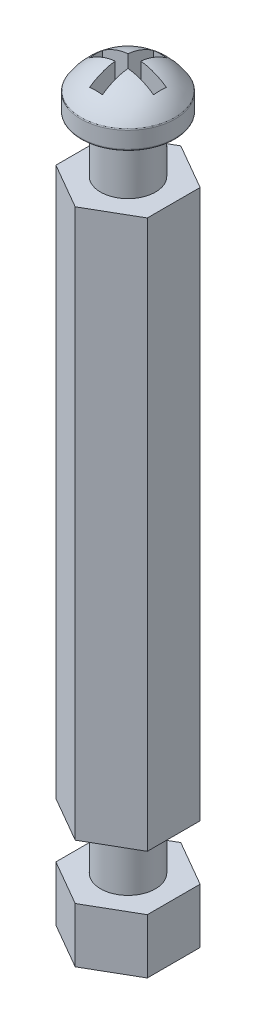
ISO-10303-21;
HEADER;
FILE_DESCRIPTION(('STEP AP214'),'2;1');
FILE_NAME('part.step','',(''),(''),'','','');
FILE_SCHEMA(('AUTOMOTIVE_DESIGN { 1 0 10303 214 1 1 1 1 }'));
ENDSEC;
DATA;
#1=APPLICATION_CONTEXT('core data for automotive mechanical design processes');
#2=APPLICATION_PROTOCOL_DEFINITION('international standard','automotive_design',2000,#1);
#3=PRODUCT_CONTEXT('',#1,'mechanical');
#4=PRODUCT('Part','Part','',(#3));
#5=PRODUCT_RELATED_PRODUCT_CATEGORY('part','',(#4));
#6=PRODUCT_DEFINITION_FORMATION('','',#4);
#7=PRODUCT_DEFINITION_CONTEXT('part definition',#1,'design');
#8=PRODUCT_DEFINITION('design','',#6,#7);
#9=PRODUCT_DEFINITION_SHAPE('','',#8);
#10=(LENGTH_UNIT() NAMED_UNIT(*) SI_UNIT(.MILLI.,.METRE.));
#11=(NAMED_UNIT(*) PLANE_ANGLE_UNIT() SI_UNIT($,.RADIAN.));
#12=(NAMED_UNIT(*) SI_UNIT($,.STERADIAN.) SOLID_ANGLE_UNIT());
#13=UNCERTAINTY_MEASURE_WITH_UNIT(LENGTH_MEASURE(1.E-05),#10,'distance_accuracy_value','');
#14=(GEOMETRIC_REPRESENTATION_CONTEXT(3) GLOBAL_UNCERTAINTY_ASSIGNED_CONTEXT((#13)) GLOBAL_UNIT_ASSIGNED_CONTEXT((#10,
#11,#12)) REPRESENTATION_CONTEXT('',''));
#15=CARTESIAN_POINT('',(0.,0.,0.));
#16=DIRECTION('',(0.,0.,1.));
#17=DIRECTION('',(1.,0.,0.));
#18=AXIS2_PLACEMENT_3D('',#15,#16,#17);
#19=CARTESIAN_POINT('',(2.5,-3.,-1.44337567297407));
#20=DIRECTION('',(1.,0.,0.));
#21=DIRECTION('',(0.,0.,-1.));
#22=AXIS2_PLACEMENT_3D('',#19,#20,#21);
#23=PLANE('',#22);
#24=DIRECTION('',(0.,0.,1.));
#25=VECTOR('',#24,1.);
#26=CARTESIAN_POINT('',(2.5,-6.,-1.44337567297407));
#27=LINE('',#26,#25);
#28=CARTESIAN_POINT('',(2.5,-6.,-1.44337567297407));
#29=VERTEX_POINT('',#28);
#30=CARTESIAN_POINT('',(2.5,-6.,1.44337567297407));
#31=VERTEX_POINT('',#30);
#32=EDGE_CURVE('E136',#29,#31,#27,.T.);
#33=ORIENTED_EDGE('',*,*,#32,.F.);
#34=DIRECTION('',(0.,-1.,0.));
#35=VECTOR('',#34,1.);
#36=CARTESIAN_POINT('',(2.5,-3.,-1.44337567297407));
#37=LINE('',#36,#35);
#38=CARTESIAN_POINT('',(2.5,-3.,-1.44337567297407));
#39=VERTEX_POINT('',#38);
#40=EDGE_CURVE('E12',#39,#29,#37,.T.);
#41=ORIENTED_EDGE('',*,*,#40,.F.);
#42=DIRECTION('',(0.,0.,1.));
#43=VECTOR('',#42,1.);
#44=CARTESIAN_POINT('',(2.5,-3.,-1.44337567297407));
#45=LINE('',#44,#43);
#46=CARTESIAN_POINT('',(2.5,-3.,1.44337567297407));
#47=VERTEX_POINT('',#46);
#48=EDGE_CURVE('E151',#39,#47,#45,.T.);
#49=ORIENTED_EDGE('',*,*,#48,.T.);
#50=DIRECTION('',(0.,-1.,0.));
#51=VECTOR('',#50,1.);
#52=CARTESIAN_POINT('',(2.5,-3.,1.44337567297407));
#53=LINE('',#52,#51);
#54=EDGE_CURVE('E54',#47,#31,#53,.T.);
#55=ORIENTED_EDGE('',*,*,#54,.T.);
#56=EDGE_LOOP('',(#33,#41,#49,#55));
#57=FACE_BOUND('',#56,.T.);
#58=ADVANCED_FACE('F51',(#57),#23,.T.);
#59=CARTESIAN_POINT('',(0.,-3.,-2.88675134594813));
#60=DIRECTION('',(0.5,0.,-0.866025403784439));
#61=DIRECTION('',(-0.866025403784439,0.,-0.5));
#62=AXIS2_PLACEMENT_3D('',#59,#60,#61);
#63=PLANE('',#62);
#64=DIRECTION('',(0.866025403784439,0.,0.5));
#65=VECTOR('',#64,1.);
#66=CARTESIAN_POINT('',(0.,-6.,-2.88675134594813));
#67=LINE('',#66,#65);
#68=CARTESIAN_POINT('',(0.,-6.,-2.88675134594813));
#69=VERTEX_POINT('',#68);
#70=EDGE_CURVE('E149',#69,#29,#67,.T.);
#71=ORIENTED_EDGE('',*,*,#70,.F.);
#72=DIRECTION('',(0.,-1.,0.));
#73=VECTOR('',#72,1.);
#74=CARTESIAN_POINT('',(0.,-3.,-2.88675134594813));
#75=LINE('',#74,#73);
#76=CARTESIAN_POINT('',(0.,-3.,-2.88675134594813));
#77=VERTEX_POINT('',#76);
#78=EDGE_CURVE('E60',#77,#69,#75,.T.);
#79=ORIENTED_EDGE('',*,*,#78,.F.);
#80=DIRECTION('',(0.866025403784439,0.,0.5));
#81=VECTOR('',#80,1.);
#82=CARTESIAN_POINT('',(0.,-3.,-2.88675134594813));
#83=LINE('',#82,#81);
#84=EDGE_CURVE('E126',#77,#39,#83,.T.);
#85=ORIENTED_EDGE('',*,*,#84,.T.);
#86=ORIENTED_EDGE('',*,*,#40,.T.);
#87=EDGE_LOOP('',(#71,#79,#85,#86));
#88=FACE_BOUND('',#87,.T.);
#89=ADVANCED_FACE('F159',(#88),#63,.T.);
#90=CARTESIAN_POINT('',(-2.5,-3.,-1.44337567297406));
#91=DIRECTION('',(-0.5,0.,-0.866025403784439));
#92=DIRECTION('',(-0.866025403784439,0.,0.5));
#93=AXIS2_PLACEMENT_3D('',#90,#91,#92);
#94=PLANE('',#93);
#95=DIRECTION('',(0.866025403784439,0.,-0.5));
#96=VECTOR('',#95,1.);
#97=CARTESIAN_POINT('',(-2.5,-6.,-1.44337567297406));
#98=LINE('',#97,#96);
#99=CARTESIAN_POINT('',(-2.5,-6.,-1.44337567297406));
#100=VERTEX_POINT('',#99);
#101=EDGE_CURVE('E113',#100,#69,#98,.T.);
#102=ORIENTED_EDGE('',*,*,#101,.F.);
#103=DIRECTION('',(0.,-1.,0.));
#104=VECTOR('',#103,1.);
#105=CARTESIAN_POINT('',(-2.5,-3.,-1.44337567297406));
#106=LINE('',#105,#104);
#107=CARTESIAN_POINT('',(-2.5,-3.,-1.44337567297406));
#108=VERTEX_POINT('',#107);
#109=EDGE_CURVE('E108',#108,#100,#106,.T.);
#110=ORIENTED_EDGE('',*,*,#109,.F.);
#111=DIRECTION('',(0.866025403784439,0.,-0.5));
#112=VECTOR('',#111,1.);
#113=CARTESIAN_POINT('',(-2.5,-3.,-1.44337567297406));
#114=LINE('',#113,#112);
#115=EDGE_CURVE('E111',#108,#77,#114,.T.);
#116=ORIENTED_EDGE('',*,*,#115,.T.);
#117=ORIENTED_EDGE('',*,*,#78,.T.);
#118=EDGE_LOOP('',(#102,#110,#116,#117));
#119=FACE_BOUND('',#118,.T.);
#120=ADVANCED_FACE('F110',(#119),#94,.T.);
#121=CARTESIAN_POINT('',(-2.5,-3.,1.44337567297406));
#122=DIRECTION('',(-1.,0.,0.));
#123=DIRECTION('',(0.,0.,1.));
#124=AXIS2_PLACEMENT_3D('',#121,#122,#123);
#125=PLANE('',#124);
#126=DIRECTION('',(0.,0.,-1.));
#127=VECTOR('',#126,1.);
#128=CARTESIAN_POINT('',(-2.5,-6.,1.44337567297406));
#129=LINE('',#128,#127);
#130=CARTESIAN_POINT('',(-2.5,-6.,1.44337567297406));
#131=VERTEX_POINT('',#130);
#132=EDGE_CURVE('E146',#131,#100,#129,.T.);
#133=ORIENTED_EDGE('',*,*,#132,.F.);
#134=DIRECTION('',(0.,-1.,0.));
#135=VECTOR('',#134,1.);
#136=CARTESIAN_POINT('',(-2.5,-3.,1.44337567297406));
#137=LINE('',#136,#135);
#138=CARTESIAN_POINT('',(-2.5,-3.,1.44337567297406));
#139=VERTEX_POINT('',#138);
#140=EDGE_CURVE('E118',#139,#131,#137,.T.);
#141=ORIENTED_EDGE('',*,*,#140,.F.);
#142=DIRECTION('',(0.,0.,-1.));
#143=VECTOR('',#142,1.);
#144=CARTESIAN_POINT('',(-2.5,-3.,1.44337567297406));
#145=LINE('',#144,#143);
#146=EDGE_CURVE('E124',#139,#108,#145,.T.);
#147=ORIENTED_EDGE('',*,*,#146,.T.);
#148=ORIENTED_EDGE('',*,*,#109,.T.);
#149=EDGE_LOOP('',(#133,#141,#147,#148));
#150=FACE_BOUND('',#149,.T.);
#151=ADVANCED_FACE('F128',(#150),#125,.T.);
#152=CARTESIAN_POINT('',(0.,-3.,2.88675134594813));
#153=DIRECTION('',(-0.5,0.,0.866025403784439));
#154=DIRECTION('',(0.866025403784439,0.,0.5));
#155=AXIS2_PLACEMENT_3D('',#152,#153,#154);
#156=PLANE('',#155);
#157=DIRECTION('',(-0.866025403784439,0.,-0.5));
#158=VECTOR('',#157,1.);
#159=CARTESIAN_POINT('',(0.,-6.,2.88675134594813));
#160=LINE('',#159,#158);
#161=CARTESIAN_POINT('',(0.,-6.,2.88675134594813));
#162=VERTEX_POINT('',#161);
#163=EDGE_CURVE('E143',#162,#131,#160,.T.);
#164=ORIENTED_EDGE('',*,*,#163,.F.);
#165=DIRECTION('',(0.,-1.,0.));
#166=VECTOR('',#165,1.);
#167=CARTESIAN_POINT('',(0.,-3.,2.88675134594813));
#168=LINE('',#167,#166);
#169=CARTESIAN_POINT('',(0.,-3.,2.88675134594813));
#170=VERTEX_POINT('',#169);
#171=EDGE_CURVE('E154',#170,#162,#168,.T.);
#172=ORIENTED_EDGE('',*,*,#171,.F.);
#173=DIRECTION('',(-0.866025403784439,0.,-0.5));
#174=VECTOR('',#173,1.);
#175=CARTESIAN_POINT('',(0.,-3.,2.88675134594813));
#176=LINE('',#175,#174);
#177=EDGE_CURVE('E129',#170,#139,#176,.T.);
#178=ORIENTED_EDGE('',*,*,#177,.T.);
#179=ORIENTED_EDGE('',*,*,#140,.T.);
#180=EDGE_LOOP('',(#164,#172,#178,#179));
#181=FACE_BOUND('',#180,.T.);
#182=ADVANCED_FACE('F172',(#181),#156,.T.);
#183=CARTESIAN_POINT('',(2.5,-3.,1.44337567297407));
#184=DIRECTION('',(0.5,0.,0.866025403784439));
#185=DIRECTION('',(0.866025403784439,0.,-0.5));
#186=AXIS2_PLACEMENT_3D('',#183,#184,#185);
#187=PLANE('',#186);
#188=DIRECTION('',(-0.866025403784439,0.,0.5));
#189=VECTOR('',#188,1.);
#190=CARTESIAN_POINT('',(2.5,-6.,1.44337567297407));
#191=LINE('',#190,#189);
#192=EDGE_CURVE('E139',#31,#162,#191,.T.);
#193=ORIENTED_EDGE('',*,*,#192,.F.);
#194=ORIENTED_EDGE('',*,*,#54,.F.);
#195=DIRECTION('',(-0.866025403784439,0.,0.5));
#196=VECTOR('',#195,1.);
#197=CARTESIAN_POINT('',(2.5,-3.,1.44337567297407));
#198=LINE('',#197,#196);
#199=EDGE_CURVE('E131',#47,#170,#198,.T.);
#200=ORIENTED_EDGE('',*,*,#199,.T.);
#201=ORIENTED_EDGE('',*,*,#171,.T.);
#202=EDGE_LOOP('',(#193,#194,#200,#201));
#203=FACE_BOUND('',#202,.T.);
#204=ADVANCED_FACE('F156',(#203),#187,.T.);
#205=CARTESIAN_POINT('',(0.,-3.,0.));
#206=DIRECTION('',(0.,-1.,0.));
#207=DIRECTION('',(0.,0.,-1.));
#208=AXIS2_PLACEMENT_3D('',#205,#206,#207);
#209=PLANE('',#208);
#210=CARTESIAN_POINT('',(0.,-3.,0.));
#211=DIRECTION('',(0.,-1.,0.));
#212=DIRECTION('',(0.,0.,-1.));
#213=AXIS2_PLACEMENT_3D('',#210,#211,#212);
#214=CIRCLE('',#213,1.5);
#215=CARTESIAN_POINT('',(0.,-3.,-1.5));
#216=VERTEX_POINT('',#215);
#217=EDGE_CURVE('E140',#216,#216,#214,.T.);
#218=ORIENTED_EDGE('',*,*,#217,.T.);
#219=EDGE_LOOP('',(#218));
#220=FACE_BOUND('',#219,.T.);
#221=ORIENTED_EDGE('',*,*,#48,.F.);
#222=ORIENTED_EDGE('',*,*,#84,.F.);
#223=ORIENTED_EDGE('',*,*,#115,.F.);
#224=ORIENTED_EDGE('',*,*,#146,.F.);
#225=ORIENTED_EDGE('',*,*,#177,.F.);
#226=ORIENTED_EDGE('',*,*,#199,.F.);
#227=EDGE_LOOP('',(#221,#222,#223,#224,#225,#226));
#228=FACE_BOUND('',#227,.T.);
#229=ADVANCED_FACE('F122',(#220,#228),#209,.F.);
#230=CARTESIAN_POINT('',(0.,-6.,0.));
#231=DIRECTION('',(0.,-1.,0.));
#232=DIRECTION('',(0.,0.,-1.));
#233=AXIS2_PLACEMENT_3D('',#230,#231,#232);
#234=PLANE('',#233);
#235=CARTESIAN_POINT('',(0.,-6.,0.));
#236=DIRECTION('',(0.,-1.,0.));
#237=DIRECTION('',(0.,0.,-1.));
#238=AXIS2_PLACEMENT_3D('',#235,#236,#237);
#239=CIRCLE('',#238,1.5);
#240=CARTESIAN_POINT('',(0.,-6.,-1.5));
#241=VERTEX_POINT('',#240);
#242=EDGE_CURVE('E195',#241,#241,#239,.T.);
#243=ORIENTED_EDGE('',*,*,#242,.F.);
#244=EDGE_LOOP('',(#243));
#245=FACE_BOUND('',#244,.T.);
#246=ORIENTED_EDGE('',*,*,#32,.T.);
#247=ORIENTED_EDGE('',*,*,#192,.T.);
#248=ORIENTED_EDGE('',*,*,#163,.T.);
#249=ORIENTED_EDGE('',*,*,#132,.T.);
#250=ORIENTED_EDGE('',*,*,#101,.T.);
#251=ORIENTED_EDGE('',*,*,#70,.T.);
#252=EDGE_LOOP('',(#246,#247,#248,#249,#250,#251));
#253=FACE_BOUND('',#252,.T.);
#254=ADVANCED_FACE('F158',(#245,#253),#234,.T.);
#255=CARTESIAN_POINT('',(0.,-3.,0.));
#256=DIRECTION('',(0.,-1.,0.));
#257=DIRECTION('',(0.,0.,-1.));
#258=AXIS2_PLACEMENT_3D('',#255,#256,#257);
#259=CYLINDRICAL_SURFACE('',#258,1.5);
#260=ORIENTED_EDGE('',*,*,#217,.F.);
#261=EDGE_LOOP('',(#260));
#262=FACE_BOUND('',#261,.T.);
#263=ORIENTED_EDGE('',*,*,#242,.T.);
#264=EDGE_LOOP('',(#263));
#265=FACE_BOUND('',#264,.T.);
#266=ADVANCED_FACE('F183',(#262,#265),#259,.F.);
#267=CLOSED_SHELL('',(#58,#89,#120,#151,#182,#204,#229,#254,#266));
#268=MANIFOLD_SOLID_BREP('B2',#267);
#269=CARTESIAN_POINT('',(0.,33.,0.));
#270=DIRECTION('',(0.,1.,0.));
#271=DIRECTION('',(-1.,0.,0.));
#272=AXIS2_PLACEMENT_3D('',#269,#270,#271);
#273=PLANE('',#272);
#274=CARTESIAN_POINT('',(0.,33.,0.));
#275=DIRECTION('',(0.,1.,0.));
#276=DIRECTION('',(-1.,0.,0.));
#277=AXIS2_PLACEMENT_3D('',#274,#275,#276);
#278=CIRCLE('',#277,2.47767710879357);
#279=CARTESIAN_POINT('',(-2.47767710879357,33.,0.));
#280=VERTEX_POINT('',#279);
#281=EDGE_CURVE('E49',#280,#280,#278,.F.);
#282=ORIENTED_EDGE('',*,*,#281,.T.);
#283=EDGE_LOOP('',(#282));
#284=FACE_BOUND('',#283,.T.);
#285=DIRECTION('',(0.,0.,-1.));
#286=VECTOR('',#285,1.);
#287=CARTESIAN_POINT('',(-1.75,33.,0.));
#288=LINE('',#287,#286);
#289=CARTESIAN_POINT('',(-1.75,33.,0.35));
#290=VERTEX_POINT('',#289);
#291=CARTESIAN_POINT('',(-1.75,33.,-0.35));
#292=VERTEX_POINT('',#291);
#293=EDGE_CURVE('E463',#290,#292,#288,.T.);
#294=ORIENTED_EDGE('',*,*,#293,.F.);
#295=DIRECTION('',(1.,0.,0.));
#296=VECTOR('',#295,1.);
#297=CARTESIAN_POINT('',(0.,33.,0.35));
#298=LINE('',#297,#296);
#299=CARTESIAN_POINT('',(-1.45859521458148,33.,0.35));
#300=VERTEX_POINT('',#299);
#301=EDGE_CURVE('E467',#290,#300,#298,.T.);
#302=ORIENTED_EDGE('',*,*,#301,.T.);
#303=CARTESIAN_POINT('',(0.,33.,0.));
#304=DIRECTION('',(0.,1.,0.));
#305=DIRECTION('',(-1.,0.,0.));
#306=AXIS2_PLACEMENT_3D('',#303,#304,#305);
#307=CIRCLE('',#306,1.5);
#308=CARTESIAN_POINT('',(-0.35,33.,1.45859521458148));
#309=VERTEX_POINT('',#308);
#310=EDGE_CURVE('E521',#300,#309,#307,.T.);
#311=ORIENTED_EDGE('',*,*,#310,.T.);
#312=DIRECTION('',(0.,0.,-1.));
#313=VECTOR('',#312,1.);
#314=CARTESIAN_POINT('',(-0.35,33.,0.));
#315=LINE('',#314,#313);
#316=CARTESIAN_POINT('',(-0.35,33.,1.75));
#317=VERTEX_POINT('',#316);
#318=EDGE_CURVE('E412',#317,#309,#315,.T.);
#319=ORIENTED_EDGE('',*,*,#318,.F.);
#320=DIRECTION('',(1.,0.,0.));
#321=VECTOR('',#320,1.);
#322=CARTESIAN_POINT('',(0.,33.,1.75));
#323=LINE('',#322,#321);
#324=CARTESIAN_POINT('',(0.35,33.,1.75));
#325=VERTEX_POINT('',#324);
#326=EDGE_CURVE('E404',#317,#325,#323,.T.);
#327=ORIENTED_EDGE('',*,*,#326,.T.);
#328=DIRECTION('',(0.,0.,-1.));
#329=VECTOR('',#328,1.);
#330=CARTESIAN_POINT('',(0.35,33.,0.));
#331=LINE('',#330,#329);
#332=CARTESIAN_POINT('',(0.35,33.,1.45859521458148));
#333=VERTEX_POINT('',#332);
#334=EDGE_CURVE('E415',#325,#333,#331,.T.);
#335=ORIENTED_EDGE('',*,*,#334,.T.);
#336=CARTESIAN_POINT('',(1.45859521458148,33.,0.35));
#337=VERTEX_POINT('',#336);
#338=EDGE_CURVE('E957',#333,#337,#307,.T.);
#339=ORIENTED_EDGE('',*,*,#338,.T.);
#340=DIRECTION('',(1.,0.,0.));
#341=VECTOR('',#340,1.);
#342=CARTESIAN_POINT('',(0.,33.,0.35));
#343=LINE('',#342,#341);
#344=CARTESIAN_POINT('',(1.75,33.,0.35));
#345=VERTEX_POINT('',#344);
#346=EDGE_CURVE('E424',#337,#345,#343,.T.);
#347=ORIENTED_EDGE('',*,*,#346,.T.);
#348=DIRECTION('',(0.,0.,-1.));
#349=VECTOR('',#348,1.);
#350=CARTESIAN_POINT('',(1.75,33.,0.));
#351=LINE('',#350,#349);
#352=CARTESIAN_POINT('',(1.75,33.,-0.35));
#353=VERTEX_POINT('',#352);
#354=EDGE_CURVE('E437',#345,#353,#351,.T.);
#355=ORIENTED_EDGE('',*,*,#354,.T.);
#356=DIRECTION('',(1.,0.,0.));
#357=VECTOR('',#356,1.);
#358=CARTESIAN_POINT('',(0.,33.,-0.35));
#359=LINE('',#358,#357);
#360=CARTESIAN_POINT('',(1.45859521458148,33.,-0.35));
#361=VERTEX_POINT('',#360);
#362=EDGE_CURVE('E441',#361,#353,#359,.T.);
#363=ORIENTED_EDGE('',*,*,#362,.F.);
#364=CARTESIAN_POINT('',(0.35,33.,-1.45859521458148));
#365=VERTEX_POINT('',#364);
#366=EDGE_CURVE('E974',#361,#365,#307,.T.);
#367=ORIENTED_EDGE('',*,*,#366,.T.);
#368=DIRECTION('',(0.,0.,-1.));
#369=VECTOR('',#368,1.);
#370=CARTESIAN_POINT('',(0.35,33.,0.));
#371=LINE('',#370,#369);
#372=CARTESIAN_POINT('',(0.35,33.,-1.75));
#373=VERTEX_POINT('',#372);
#374=EDGE_CURVE('E446',#365,#373,#371,.T.);
#375=ORIENTED_EDGE('',*,*,#374,.T.);
#376=DIRECTION('',(1.,0.,0.));
#377=VECTOR('',#376,1.);
#378=CARTESIAN_POINT('',(0.,33.,-1.75));
#379=LINE('',#378,#377);
#380=CARTESIAN_POINT('',(-0.35,33.,-1.75));
#381=VERTEX_POINT('',#380);
#382=EDGE_CURVE('E451',#381,#373,#379,.T.);
#383=ORIENTED_EDGE('',*,*,#382,.F.);
#384=DIRECTION('',(0.,0.,-1.));
#385=VECTOR('',#384,1.);
#386=CARTESIAN_POINT('',(-0.35,33.,0.));
#387=LINE('',#386,#385);
#388=CARTESIAN_POINT('',(-0.35,33.,-1.45859521458148));
#389=VERTEX_POINT('',#388);
#390=EDGE_CURVE('E454',#389,#381,#387,.T.);
#391=ORIENTED_EDGE('',*,*,#390,.F.);
#392=CARTESIAN_POINT('',(-1.45859521458148,33.,-0.35));
#393=VERTEX_POINT('',#392);
#394=EDGE_CURVE('E969',#389,#393,#307,.T.);
#395=ORIENTED_EDGE('',*,*,#394,.T.);
#396=DIRECTION('',(1.,0.,0.));
#397=VECTOR('',#396,1.);
#398=CARTESIAN_POINT('',(0.,33.,-0.35));
#399=LINE('',#398,#397);
#400=EDGE_CURVE('E460',#292,#393,#399,.T.);
#401=ORIENTED_EDGE('',*,*,#400,.F.);
#402=EDGE_LOOP('',(#294,#302,#311,#319,#327,#335,#339,#347,#355,#363,#367,#375,#383,#391,#395,#401));
#403=FACE_BOUND('',#402,.T.);
#404=ADVANCED_FACE('F248',(#284,#403),#273,.F.);
#405=CARTESIAN_POINT('',(1.25,30.,2.1650635094611));
#406=DIRECTION('',(-0.5,0.,-0.866025403784439));
#407=DIRECTION('',(-0.866025403784439,0.,0.5));
#408=AXIS2_PLACEMENT_3D('',#405,#406,#407);
#409=PLANE('',#408);
#410=DIRECTION('',(0.866025403784439,0.,-0.5));
#411=VECTOR('',#410,1.);
#412=CARTESIAN_POINT('',(1.25,0.,2.1650635094611));
#413=LINE('',#412,#411);
#414=CARTESIAN_POINT('',(0.,0.,2.88675134594813));
#415=VERTEX_POINT('',#414);
#416=CARTESIAN_POINT('',(2.5,0.,1.44337567297407));
#417=VERTEX_POINT('',#416);
#418=EDGE_CURVE('E536',#415,#417,#413,.T.);
#419=ORIENTED_EDGE('',*,*,#418,.T.);
#420=DIRECTION('',(0.,-1.,0.));
#421=VECTOR('',#420,1.);
#422=CARTESIAN_POINT('',(2.5,30.,1.44337567297407));
#423=LINE('',#422,#421);
#424=CARTESIAN_POINT('',(2.5,30.,1.44337567297407));
#425=VERTEX_POINT('',#424);
#426=EDGE_CURVE('E531',#425,#417,#423,.T.);
#427=ORIENTED_EDGE('',*,*,#426,.F.);
#428=DIRECTION('',(0.866025403784439,0.,-0.5));
#429=VECTOR('',#428,1.);
#430=CARTESIAN_POINT('',(1.25,30.,2.1650635094611));
#431=LINE('',#430,#429);
#432=CARTESIAN_POINT('',(0.,30.,2.88675134594813));
#433=VERTEX_POINT('',#432);
#434=EDGE_CURVE('E540',#433,#425,#431,.T.);
#435=ORIENTED_EDGE('',*,*,#434,.F.);
#436=DIRECTION('',(0.,-1.,0.));
#437=VECTOR('',#436,1.);
#438=CARTESIAN_POINT('',(0.,30.,2.88675134594813));
#439=LINE('',#438,#437);
#440=EDGE_CURVE('E560',#433,#415,#439,.T.);
#441=ORIENTED_EDGE('',*,*,#440,.T.);
#442=EDGE_LOOP('',(#419,#427,#435,#441));
#443=FACE_BOUND('',#442,.T.);
#444=ADVANCED_FACE('F653',(#443),#409,.F.);
#445=CARTESIAN_POINT('',(2.5,30.,0.));
#446=DIRECTION('',(-1.,0.,0.));
#447=DIRECTION('',(0.,0.,1.));
#448=AXIS2_PLACEMENT_3D('',#445,#446,#447);
#449=PLANE('',#448);
#450=DIRECTION('',(0.,0.,-1.));
#451=VECTOR('',#450,1.);
#452=CARTESIAN_POINT('',(2.5,0.,0.));
#453=LINE('',#452,#451);
#454=CARTESIAN_POINT('',(2.5,0.,-1.44337567297407));
#455=VERTEX_POINT('',#454);
#456=EDGE_CURVE('E564',#417,#455,#453,.T.);
#457=ORIENTED_EDGE('',*,*,#456,.T.);
#458=DIRECTION('',(0.,-1.,0.));
#459=VECTOR('',#458,1.);
#460=CARTESIAN_POINT('',(2.5,30.,-1.44337567297407));
#461=LINE('',#460,#459);
#462=CARTESIAN_POINT('',(2.5,30.,-1.44337567297407));
#463=VERTEX_POINT('',#462);
#464=EDGE_CURVE('E593',#463,#455,#461,.T.);
#465=ORIENTED_EDGE('',*,*,#464,.F.);
#466=DIRECTION('',(0.,0.,-1.));
#467=VECTOR('',#466,1.);
#468=CARTESIAN_POINT('',(2.5,30.,0.));
#469=LINE('',#468,#467);
#470=EDGE_CURVE('E544',#425,#463,#469,.T.);
#471=ORIENTED_EDGE('',*,*,#470,.F.);
#472=ORIENTED_EDGE('',*,*,#426,.T.);
#473=EDGE_LOOP('',(#457,#465,#471,#472));
#474=FACE_BOUND('',#473,.T.);
#475=ADVANCED_FACE('F659',(#474),#449,.F.);
#476=CARTESIAN_POINT('',(1.25,30.,-2.1650635094611));
#477=DIRECTION('',(-0.5,0.,0.866025403784439));
#478=DIRECTION('',(0.866025403784439,0.,0.5));
#479=AXIS2_PLACEMENT_3D('',#476,#477,#478);
#480=PLANE('',#479);
#481=DIRECTION('',(-0.866025403784439,0.,-0.5));
#482=VECTOR('',#481,1.);
#483=CARTESIAN_POINT('',(1.25,0.,-2.1650635094611));
#484=LINE('',#483,#482);
#485=CARTESIAN_POINT('',(0.,0.,-2.88675134594813));
#486=VERTEX_POINT('',#485);
#487=EDGE_CURVE('E567',#455,#486,#484,.T.);
#488=ORIENTED_EDGE('',*,*,#487,.T.);
#489=DIRECTION('',(0.,-1.,0.));
#490=VECTOR('',#489,1.);
#491=CARTESIAN_POINT('',(0.,30.,-2.88675134594813));
#492=LINE('',#491,#490);
#493=CARTESIAN_POINT('',(0.,30.,-2.88675134594813));
#494=VERTEX_POINT('',#493);
#495=EDGE_CURVE('E589',#494,#486,#492,.T.);
#496=ORIENTED_EDGE('',*,*,#495,.F.);
#497=DIRECTION('',(-0.866025403784439,0.,-0.5));
#498=VECTOR('',#497,1.);
#499=CARTESIAN_POINT('',(1.25,30.,-2.1650635094611));
#500=LINE('',#499,#498);
#501=EDGE_CURVE('E548',#463,#494,#500,.T.);
#502=ORIENTED_EDGE('',*,*,#501,.F.);
#503=ORIENTED_EDGE('',*,*,#464,.T.);
#504=EDGE_LOOP('',(#488,#496,#502,#503));
#505=FACE_BOUND('',#504,.T.);
#506=ADVANCED_FACE('F695',(#505),#480,.F.);
#507=CARTESIAN_POINT('',(-1.25,30.,-2.1650635094611));
#508=DIRECTION('',(0.5,0.,0.866025403784439));
#509=DIRECTION('',(0.866025403784439,0.,-0.5));
#510=AXIS2_PLACEMENT_3D('',#507,#508,#509);
#511=PLANE('',#510);
#512=DIRECTION('',(-0.866025403784439,0.,0.5));
#513=VECTOR('',#512,1.);
#514=CARTESIAN_POINT('',(-1.25,0.,-2.1650635094611));
#515=LINE('',#514,#513);
#516=CARTESIAN_POINT('',(-2.5,0.,-1.44337567297406));
#517=VERTEX_POINT('',#516);
#518=EDGE_CURVE('E570',#486,#517,#515,.T.);
#519=ORIENTED_EDGE('',*,*,#518,.T.);
#520=DIRECTION('',(0.,-1.,0.));
#521=VECTOR('',#520,1.);
#522=CARTESIAN_POINT('',(-2.5,30.,-1.44337567297406));
#523=LINE('',#522,#521);
#524=CARTESIAN_POINT('',(-2.5,30.,-1.44337567297406));
#525=VERTEX_POINT('',#524);
#526=EDGE_CURVE('E585',#525,#517,#523,.T.);
#527=ORIENTED_EDGE('',*,*,#526,.F.);
#528=DIRECTION('',(-0.866025403784439,0.,0.5));
#529=VECTOR('',#528,1.);
#530=CARTESIAN_POINT('',(-1.25,30.,-2.1650635094611));
#531=LINE('',#530,#529);
#532=EDGE_CURVE('E551',#494,#525,#531,.T.);
#533=ORIENTED_EDGE('',*,*,#532,.F.);
#534=ORIENTED_EDGE('',*,*,#495,.T.);
#535=EDGE_LOOP('',(#519,#527,#533,#534));
#536=FACE_BOUND('',#535,.T.);
#537=ADVANCED_FACE('F691',(#536),#511,.F.);
#538=CARTESIAN_POINT('',(-2.5,30.,0.));
#539=DIRECTION('',(1.,0.,0.));
#540=DIRECTION('',(0.,0.,-1.));
#541=AXIS2_PLACEMENT_3D('',#538,#539,#540);
#542=PLANE('',#541);
#543=DIRECTION('',(0.,0.,1.));
#544=VECTOR('',#543,1.);
#545=CARTESIAN_POINT('',(-2.5,0.,0.));
#546=LINE('',#545,#544);
#547=CARTESIAN_POINT('',(-2.5,0.,1.44337567297406));
#548=VERTEX_POINT('',#547);
#549=EDGE_CURVE('E573',#517,#548,#546,.T.);
#550=ORIENTED_EDGE('',*,*,#549,.T.);
#551=DIRECTION('',(0.,-1.,0.));
#552=VECTOR('',#551,1.);
#553=CARTESIAN_POINT('',(-2.5,30.,1.44337567297406));
#554=LINE('',#553,#552);
#555=CARTESIAN_POINT('',(-2.5,30.,1.44337567297406));
#556=VERTEX_POINT('',#555);
#557=EDGE_CURVE('E581',#556,#548,#554,.T.);
#558=ORIENTED_EDGE('',*,*,#557,.F.);
#559=DIRECTION('',(0.,0.,1.));
#560=VECTOR('',#559,1.);
#561=CARTESIAN_POINT('',(-2.5,30.,0.));
#562=LINE('',#561,#560);
#563=EDGE_CURVE('E554',#525,#556,#562,.T.);
#564=ORIENTED_EDGE('',*,*,#563,.F.);
#565=ORIENTED_EDGE('',*,*,#526,.T.);
#566=EDGE_LOOP('',(#550,#558,#564,#565));
#567=FACE_BOUND('',#566,.T.);
#568=ADVANCED_FACE('F687',(#567),#542,.F.);
#569=CARTESIAN_POINT('',(-1.25,30.,2.1650635094611));
#570=DIRECTION('',(0.5,0.,-0.866025403784439));
#571=DIRECTION('',(-0.866025403784439,0.,-0.5));
#572=AXIS2_PLACEMENT_3D('',#569,#570,#571);
#573=PLANE('',#572);
#574=DIRECTION('',(0.866025403784439,0.,0.5));
#575=VECTOR('',#574,1.);
#576=CARTESIAN_POINT('',(-1.25,0.,2.1650635094611));
#577=LINE('',#576,#575);
#578=EDGE_CURVE('E545',#548,#415,#577,.T.);
#579=ORIENTED_EDGE('',*,*,#578,.T.);
#580=ORIENTED_EDGE('',*,*,#440,.F.);
#581=DIRECTION('',(0.866025403784439,0.,0.5));
#582=VECTOR('',#581,1.);
#583=CARTESIAN_POINT('',(-1.25,30.,2.1650635094611));
#584=LINE('',#583,#582);
#585=EDGE_CURVE('E557',#556,#433,#584,.T.);
#586=ORIENTED_EDGE('',*,*,#585,.F.);
#587=ORIENTED_EDGE('',*,*,#557,.T.);
#588=EDGE_LOOP('',(#579,#580,#586,#587));
#589=FACE_BOUND('',#588,.T.);
#590=ADVANCED_FACE('F680',(#589),#573,.F.);
#591=CARTESIAN_POINT('',(0.,30.,0.));
#592=DIRECTION('',(0.,1.,0.));
#593=DIRECTION('',(0.,0.,1.));
#594=AXIS2_PLACEMENT_3D('',#591,#592,#593);
#595=PLANE('',#594);
#596=CARTESIAN_POINT('',(0.,30.,0.));
#597=DIRECTION('',(0.,1.,0.));
#598=DIRECTION('',(-1.,0.,0.));
#599=AXIS2_PLACEMENT_3D('',#596,#597,#598);
#600=CIRCLE('',#599,1.5);
#601=CARTESIAN_POINT('',(-1.5,30.,0.));
#602=VERTEX_POINT('',#601);
#603=EDGE_CURVE('E526',#602,#602,#600,.T.);
#604=ORIENTED_EDGE('',*,*,#603,.F.);
#605=EDGE_LOOP('',(#604));
#606=FACE_BOUND('',#605,.T.);
#607=ORIENTED_EDGE('',*,*,#434,.T.);
#608=ORIENTED_EDGE('',*,*,#470,.T.);
#609=ORIENTED_EDGE('',*,*,#501,.T.);
#610=ORIENTED_EDGE('',*,*,#532,.T.);
#611=ORIENTED_EDGE('',*,*,#563,.T.);
#612=ORIENTED_EDGE('',*,*,#585,.T.);
#613=EDGE_LOOP('',(#607,#608,#609,#610,#611,#612));
#614=FACE_BOUND('',#613,.T.);
#615=ADVANCED_FACE('F677',(#606,#614),#595,.T.);
#616=CARTESIAN_POINT('',(0.,0.,0.));
#617=DIRECTION('',(0.,1.,0.));
#618=DIRECTION('',(0.,0.,1.));
#619=AXIS2_PLACEMENT_3D('',#616,#617,#618);
#620=PLANE('',#619);
#621=CARTESIAN_POINT('',(0.,0.,0.));
#622=DIRECTION('',(0.,1.,0.));
#623=DIRECTION('',(0.,0.,1.));
#624=AXIS2_PLACEMENT_3D('',#621,#622,#623);
#625=CIRCLE('',#624,1.5);
#626=CARTESIAN_POINT('',(0.,0.,1.5));
#627=VERTEX_POINT('',#626);
#628=EDGE_CURVE('E524',#627,#627,#625,.T.);
#629=ORIENTED_EDGE('',*,*,#628,.T.);
#630=EDGE_LOOP('',(#629));
#631=FACE_BOUND('',#630,.T.);
#632=ORIENTED_EDGE('',*,*,#418,.F.);
#633=ORIENTED_EDGE('',*,*,#578,.F.);
#634=ORIENTED_EDGE('',*,*,#549,.F.);
#635=ORIENTED_EDGE('',*,*,#518,.F.);
#636=ORIENTED_EDGE('',*,*,#487,.F.);
#637=ORIENTED_EDGE('',*,*,#456,.F.);
#638=EDGE_LOOP('',(#632,#633,#634,#635,#636,#637));
#639=FACE_BOUND('',#638,.T.);
#640=ADVANCED_FACE('F675',(#631,#639),#620,.F.);
#641=CARTESIAN_POINT('',(0.,-6.,0.));
#642=DIRECTION('',(0.,1.,0.));
#643=DIRECTION('',(0.,0.,1.));
#644=AXIS2_PLACEMENT_3D('',#641,#642,#643);
#645=CYLINDRICAL_SURFACE('',#644,1.5);
#646=CARTESIAN_POINT('',(0.,-6.,0.));
#647=DIRECTION('',(0.,1.,0.));
#648=DIRECTION('',(0.,0.,1.));
#649=AXIS2_PLACEMENT_3D('',#646,#647,#648);
#650=CIRCLE('',#649,1.5);
#651=CARTESIAN_POINT('',(0.,-6.,1.5));
#652=VERTEX_POINT('',#651);
#653=EDGE_CURVE('E532',#652,#652,#650,.T.);
#654=ORIENTED_EDGE('',*,*,#653,.T.);
#655=EDGE_LOOP('',(#654));
#656=FACE_BOUND('',#655,.T.);
#657=ORIENTED_EDGE('',*,*,#628,.F.);
#658=EDGE_LOOP('',(#657));
#659=FACE_BOUND('',#658,.T.);
#660=ADVANCED_FACE('F671',(#656,#659),#645,.T.);
#661=CARTESIAN_POINT('',(0.,-6.,0.));
#662=DIRECTION('',(0.,1.,0.));
#663=DIRECTION('',(0.,0.,1.));
#664=AXIS2_PLACEMENT_3D('',#661,#662,#663);
#665=PLANE('',#664);
#666=ORIENTED_EDGE('',*,*,#653,.F.);
#667=EDGE_LOOP('',(#666));
#668=FACE_BOUND('',#667,.T.);
#669=ADVANCED_FACE('F667',(#668),#665,.F.);
#670=CARTESIAN_POINT('',(0.,30.,0.));
#671=DIRECTION('',(0.,1.,0.));
#672=DIRECTION('',(-1.,0.,0.));
#673=AXIS2_PLACEMENT_3D('',#670,#671,#672);
#674=CYLINDRICAL_SURFACE('',#673,1.5);
#675=ORIENTED_EDGE('',*,*,#310,.F.);
#676=EDGE_CURVE('E520',#393,#300,#307,.T.);
#677=ORIENTED_EDGE('',*,*,#676,.F.);
#678=ORIENTED_EDGE('',*,*,#394,.F.);
#679=EDGE_CURVE('E972',#365,#389,#307,.T.);
#680=ORIENTED_EDGE('',*,*,#679,.F.);
#681=ORIENTED_EDGE('',*,*,#366,.F.);
#682=EDGE_CURVE('E977',#337,#361,#307,.T.);
#683=ORIENTED_EDGE('',*,*,#682,.F.);
#684=ORIENTED_EDGE('',*,*,#338,.F.);
#685=EDGE_CURVE('E525',#309,#333,#307,.T.);
#686=ORIENTED_EDGE('',*,*,#685,.F.);
#687=EDGE_LOOP('',(#675,#677,#678,#680,#681,#683,#684,#686));
#688=FACE_BOUND('',#687,.T.);
#689=ORIENTED_EDGE('',*,*,#603,.T.);
#690=EDGE_LOOP('',(#689));
#691=FACE_BOUND('',#690,.T.);
#692=ADVANCED_FACE('F664',(#688,#691),#674,.T.);
#693=CARTESIAN_POINT('',(0.,30.,0.));
#694=DIRECTION('',(0.,1.,0.));
#695=DIRECTION('',(-1.,0.,0.));
#696=AXIS2_PLACEMENT_3D('',#693,#694,#695);
#697=CYLINDRICAL_SURFACE('',#696,2.57767710879357);
#698=CARTESIAN_POINT('',(0.,33.1,0.));
#699=DIRECTION('',(0.,1.,0.));
#700=DIRECTION('',(-1.,0.,0.));
#701=AXIS2_PLACEMENT_3D('',#698,#699,#700);
#702=CIRCLE('',#701,2.57767710879357);
#703=CARTESIAN_POINT('',(-2.57767710879357,33.1,0.));
#704=VERTEX_POINT('',#703);
#705=EDGE_CURVE('E257',#704,#704,#702,.T.);
#706=ORIENTED_EDGE('',*,*,#705,.T.);
#707=EDGE_LOOP('',(#706));
#708=FACE_BOUND('',#707,.T.);
#709=CARTESIAN_POINT('',(0.,34.,0.));
#710=DIRECTION('',(0.,1.,0.));
#711=DIRECTION('',(-1.,0.,0.));
#712=AXIS2_PLACEMENT_3D('',#709,#710,#711);
#713=CIRCLE('',#712,2.57767710879357);
#714=CARTESIAN_POINT('',(-2.57767710879357,34.,0.));
#715=VERTEX_POINT('',#714);
#716=EDGE_CURVE('E516',#715,#715,#713,.T.);
#717=ORIENTED_EDGE('',*,*,#716,.F.);
#718=EDGE_LOOP('',(#717));
#719=FACE_BOUND('',#718,.T.);
#720=ADVANCED_FACE('F641',(#708,#719),#697,.T.);
#721=CARTESIAN_POINT('',(0.,34.,0.));
#722=DIRECTION('',(0.,1.,0.));
#723=DIRECTION('',(-1.,0.,0.));
#724=AXIS2_PLACEMENT_3D('',#721,#722,#723);
#725=TOROIDAL_SURFACE('',#724,2.45267710879357,0.125);
#726=CARTESIAN_POINT('',(0.,34.0652173913044,0.));
#727=DIRECTION('',(0.,1.,0.));
#728=DIRECTION('',(-1.,0.,0.));
#729=AXIS2_PLACEMENT_3D('',#726,#727,#728);
#730=CIRCLE('',#729,2.55931524395851);
#731=CARTESIAN_POINT('',(-2.55931524395851,34.0652173913044,0.));
#732=VERTEX_POINT('',#731);
#733=EDGE_CURVE('E477',#732,#732,#730,.T.);
#734=ORIENTED_EDGE('',*,*,#733,.F.);
#735=EDGE_LOOP('',(#734));
#736=FACE_BOUND('',#735,.T.);
#737=ORIENTED_EDGE('',*,*,#716,.T.);
#738=EDGE_LOOP('',(#737));
#739=FACE_BOUND('',#738,.T.);
#740=ADVANCED_FACE('F768',(#736,#739),#725,.T.);
#741=CARTESIAN_POINT('',(0.,32.5,0.));
#742=DIRECTION('',(0.,1.,0.));
#743=DIRECTION('',(1.,0.,0.));
#744=AXIS2_PLACEMENT_3D('',#741,#742,#743);
#745=SPHERICAL_SURFACE('',#744,3.);
#746=CARTESIAN_POINT('',(0.35,32.5,0.));
#747=DIRECTION('',(1.,0.,0.));
#748=DIRECTION('',(0.,0.,-1.));
#749=AXIS2_PLACEMENT_3D('',#746,#747,#748);
#750=CIRCLE('',#749,2.97951338308792);
#751=CARTESIAN_POINT('',(0.35,35.4588849251027,0.35));
#752=VERTEX_POINT('',#751);
#753=CARTESIAN_POINT('',(0.35,34.9114311103575,1.75));
#754=VERTEX_POINT('',#753);
#755=EDGE_CURVE('E530',#752,#754,#750,.T.);
#756=ORIENTED_EDGE('',*,*,#755,.T.);
#757=CARTESIAN_POINT('',(0.,32.5,1.75));
#758=DIRECTION('',(0.,0.,1.));
#759=DIRECTION('',(1.,0.,0.));
#760=AXIS2_PLACEMENT_3D('',#757,#758,#759);
#761=CIRCLE('',#760,2.43669858620224);
#762=CARTESIAN_POINT('',(-0.35,34.9114311103575,1.75));
#763=VERTEX_POINT('',#762);
#764=EDGE_CURVE('E407',#754,#763,#761,.T.);
#765=ORIENTED_EDGE('',*,*,#764,.T.);
#766=CARTESIAN_POINT('',(-0.35,32.5,0.));
#767=DIRECTION('',(1.,0.,0.));
#768=DIRECTION('',(0.,0.,-1.));
#769=AXIS2_PLACEMENT_3D('',#766,#767,#768);
#770=CIRCLE('',#769,2.97951338308792);
#771=CARTESIAN_POINT('',(-0.35,35.4588849251027,0.35));
#772=VERTEX_POINT('',#771);
#773=EDGE_CURVE('E633',#772,#763,#770,.T.);
#774=ORIENTED_EDGE('',*,*,#773,.F.);
#775=CARTESIAN_POINT('',(0.,32.5,0.35));
#776=DIRECTION('',(0.,0.,1.));
#777=DIRECTION('',(1.,0.,0.));
#778=AXIS2_PLACEMENT_3D('',#775,#776,#777);
#779=CIRCLE('',#778,2.97951338308792);
#780=CARTESIAN_POINT('',(-1.75,34.9114311103575,0.35));
#781=VERTEX_POINT('',#780);
#782=EDGE_CURVE('E629',#772,#781,#779,.T.);
#783=ORIENTED_EDGE('',*,*,#782,.T.);
#784=CARTESIAN_POINT('',(-1.75,32.5,0.));
#785=DIRECTION('',(1.,0.,0.));
#786=DIRECTION('',(0.,0.,-1.));
#787=AXIS2_PLACEMENT_3D('',#784,#785,#786);
#788=CIRCLE('',#787,2.43669858620224);
#789=CARTESIAN_POINT('',(-1.75,34.9114311103575,-0.35));
#790=VERTEX_POINT('',#789);
#791=EDGE_CURVE('E626',#790,#781,#788,.T.);
#792=ORIENTED_EDGE('',*,*,#791,.F.);
#793=CARTESIAN_POINT('',(0.,32.5,-0.35));
#794=DIRECTION('',(0.,0.,1.));
#795=DIRECTION('',(1.,0.,0.));
#796=AXIS2_PLACEMENT_3D('',#793,#794,#795);
#797=CIRCLE('',#796,2.97951338308792);
#798=CARTESIAN_POINT('',(-0.35,35.4588849251027,-0.35));
#799=VERTEX_POINT('',#798);
#800=EDGE_CURVE('E623',#799,#790,#797,.T.);
#801=ORIENTED_EDGE('',*,*,#800,.F.);
#802=CARTESIAN_POINT('',(-0.35,32.5,0.));
#803=DIRECTION('',(1.,0.,0.));
#804=DIRECTION('',(0.,0.,-1.));
#805=AXIS2_PLACEMENT_3D('',#802,#803,#804);
#806=CIRCLE('',#805,2.97951338308792);
#807=CARTESIAN_POINT('',(-0.35,34.9114311103575,-1.75));
#808=VERTEX_POINT('',#807);
#809=EDGE_CURVE('E620',#808,#799,#806,.T.);
#810=ORIENTED_EDGE('',*,*,#809,.F.);
#811=CARTESIAN_POINT('',(0.,32.5,-1.75));
#812=DIRECTION('',(0.,0.,1.));
#813=DIRECTION('',(1.,0.,0.));
#814=AXIS2_PLACEMENT_3D('',#811,#812,#813);
#815=CIRCLE('',#814,2.43669858620224);
#816=CARTESIAN_POINT('',(0.35,34.9114311103575,-1.75));
#817=VERTEX_POINT('',#816);
#818=EDGE_CURVE('E617',#817,#808,#815,.T.);
#819=ORIENTED_EDGE('',*,*,#818,.F.);
#820=CARTESIAN_POINT('',(0.35,32.5,0.));
#821=DIRECTION('',(1.,0.,0.));
#822=DIRECTION('',(0.,0.,-1.));
#823=AXIS2_PLACEMENT_3D('',#820,#821,#822);
#824=CIRCLE('',#823,2.97951338308792);
#825=CARTESIAN_POINT('',(0.35,35.4588849251027,-0.35));
#826=VERTEX_POINT('',#825);
#827=EDGE_CURVE('E613',#817,#826,#824,.T.);
#828=ORIENTED_EDGE('',*,*,#827,.T.);
#829=CARTESIAN_POINT('',(0.,32.5,-0.35));
#830=DIRECTION('',(0.,0.,1.));
#831=DIRECTION('',(1.,0.,0.));
#832=AXIS2_PLACEMENT_3D('',#829,#830,#831);
#833=CIRCLE('',#832,2.97951338308792);
#834=CARTESIAN_POINT('',(1.75,34.9114311103575,-0.35));
#835=VERTEX_POINT('',#834);
#836=EDGE_CURVE('E610',#835,#826,#833,.T.);
#837=ORIENTED_EDGE('',*,*,#836,.F.);
#838=CARTESIAN_POINT('',(1.75,32.5,0.));
#839=DIRECTION('',(1.,0.,0.));
#840=DIRECTION('',(0.,0.,-1.));
#841=AXIS2_PLACEMENT_3D('',#838,#839,#840);
#842=CIRCLE('',#841,2.43669858620224);
#843=CARTESIAN_POINT('',(1.75,34.9114311103575,0.35));
#844=VERTEX_POINT('',#843);
#845=EDGE_CURVE('E606',#835,#844,#842,.T.);
#846=ORIENTED_EDGE('',*,*,#845,.T.);
#847=CARTESIAN_POINT('',(0.,32.5,0.35));
#848=DIRECTION('',(0.,0.,1.));
#849=DIRECTION('',(1.,0.,0.));
#850=AXIS2_PLACEMENT_3D('',#847,#848,#849);
#851=CIRCLE('',#850,2.97951338308792);
#852=EDGE_CURVE('E602',#844,#752,#851,.T.);
#853=ORIENTED_EDGE('',*,*,#852,.T.);
#854=EDGE_LOOP('',(#756,#765,#774,#783,#792,#801,#810,#819,#828,#837,#846,#853));
#855=FACE_BOUND('',#854,.T.);
#856=ORIENTED_EDGE('',*,*,#733,.T.);
#857=EDGE_LOOP('',(#856));
#858=FACE_BOUND('',#857,.T.);
#859=ADVANCED_FACE('F773',(#855,#858),#745,.T.);
#860=CARTESIAN_POINT('',(0.,33.,0.));
#861=DIRECTION('',(0.,1.,0.));
#862=DIRECTION('',(0.,0.,1.));
#863=AXIS2_PLACEMENT_3D('',#860,#861,#862);
#864=PLANE('',#863);
#865=ORIENTED_EDGE('',*,*,#682,.T.);
#866=CARTESIAN_POINT('',(0.35,33.,-0.35));
#867=VERTEX_POINT('',#866);
#868=EDGE_CURVE('E442',#867,#361,#359,.T.);
#869=ORIENTED_EDGE('',*,*,#868,.F.);
#870=EDGE_CURVE('E447',#867,#365,#371,.T.);
#871=ORIENTED_EDGE('',*,*,#870,.T.);
#872=ORIENTED_EDGE('',*,*,#679,.T.);
#873=CARTESIAN_POINT('',(-0.35,33.,-0.35));
#874=VERTEX_POINT('',#873);
#875=EDGE_CURVE('E455',#874,#389,#387,.T.);
#876=ORIENTED_EDGE('',*,*,#875,.F.);
#877=EDGE_CURVE('E459',#393,#874,#399,.T.);
#878=ORIENTED_EDGE('',*,*,#877,.F.);
#879=ORIENTED_EDGE('',*,*,#676,.T.);
#880=CARTESIAN_POINT('',(-0.35,33.,0.35));
#881=VERTEX_POINT('',#880);
#882=EDGE_CURVE('E466',#300,#881,#298,.T.);
#883=ORIENTED_EDGE('',*,*,#882,.T.);
#884=EDGE_CURVE('E471',#309,#881,#315,.T.);
#885=ORIENTED_EDGE('',*,*,#884,.F.);
#886=ORIENTED_EDGE('',*,*,#685,.T.);
#887=CARTESIAN_POINT('',(0.35,33.,0.35));
#888=VERTEX_POINT('',#887);
#889=EDGE_CURVE('E418',#333,#888,#331,.T.);
#890=ORIENTED_EDGE('',*,*,#889,.T.);
#891=EDGE_CURVE('E433',#888,#337,#343,.T.);
#892=ORIENTED_EDGE('',*,*,#891,.T.);
#893=EDGE_LOOP('',(#865,#869,#871,#872,#876,#878,#879,#883,#885,#886,#890,#892));
#894=FACE_BOUND('',#893,.T.);
#895=ADVANCED_FACE('F779',(#894),#864,.T.);
#896=CARTESIAN_POINT('',(0.,33.,1.75));
#897=DIRECTION('',(0.,0.,1.));
#898=DIRECTION('',(1.,0.,0.));
#899=AXIS2_PLACEMENT_3D('',#896,#897,#898);
#900=PLANE('',#899);
#901=DIRECTION('',(0.,1.,0.));
#902=VECTOR('',#901,1.);
#903=CARTESIAN_POINT('',(0.35,33.,1.75));
#904=LINE('',#903,#902);
#905=EDGE_CURVE('E399',#325,#754,#904,.T.);
#906=ORIENTED_EDGE('',*,*,#905,.F.);
#907=ORIENTED_EDGE('',*,*,#326,.F.);
#908=DIRECTION('',(0.,1.,0.));
#909=VECTOR('',#908,1.);
#910=CARTESIAN_POINT('',(-0.35,33.,1.75));
#911=LINE('',#910,#909);
#912=EDGE_CURVE('E474',#317,#763,#911,.T.);
#913=ORIENTED_EDGE('',*,*,#912,.T.);
#914=ORIENTED_EDGE('',*,*,#764,.F.);
#915=EDGE_LOOP('',(#906,#907,#913,#914));
#916=FACE_BOUND('',#915,.T.);
#917=ADVANCED_FACE('F401',(#916),#900,.F.);
#918=CARTESIAN_POINT('',(-0.35,33.,0.));
#919=DIRECTION('',(1.,0.,0.));
#920=DIRECTION('',(0.,0.,-1.));
#921=AXIS2_PLACEMENT_3D('',#918,#919,#920);
#922=PLANE('',#921);
#923=ORIENTED_EDGE('',*,*,#773,.T.);
#924=ORIENTED_EDGE('',*,*,#912,.F.);
#925=ORIENTED_EDGE('',*,*,#318,.T.);
#926=ORIENTED_EDGE('',*,*,#884,.T.);
#927=DIRECTION('',(0.,1.,0.));
#928=VECTOR('',#927,1.);
#929=CARTESIAN_POINT('',(-0.35,33.,0.35));
#930=LINE('',#929,#928);
#931=EDGE_CURVE('E478',#881,#772,#930,.T.);
#932=ORIENTED_EDGE('',*,*,#931,.T.);
#933=EDGE_LOOP('',(#923,#924,#925,#926,#932));
#934=FACE_BOUND('',#933,.T.);
#935=ADVANCED_FACE('F794',(#934),#922,.T.);
#936=CARTESIAN_POINT('',(0.,33.,0.35));
#937=DIRECTION('',(0.,0.,1.));
#938=DIRECTION('',(1.,0.,0.));
#939=AXIS2_PLACEMENT_3D('',#936,#937,#938);
#940=PLANE('',#939);
#941=ORIENTED_EDGE('',*,*,#931,.F.);
#942=ORIENTED_EDGE('',*,*,#882,.F.);
#943=ORIENTED_EDGE('',*,*,#301,.F.);
#944=DIRECTION('',(0.,1.,0.));
#945=VECTOR('',#944,1.);
#946=CARTESIAN_POINT('',(-1.75,33.,0.35));
#947=LINE('',#946,#945);
#948=EDGE_CURVE('E482',#290,#781,#947,.T.);
#949=ORIENTED_EDGE('',*,*,#948,.T.);
#950=ORIENTED_EDGE('',*,*,#782,.F.);
#951=EDGE_LOOP('',(#941,#942,#943,#949,#950));
#952=FACE_BOUND('',#951,.T.);
#953=ADVANCED_FACE('F801',(#952),#940,.F.);
#954=CARTESIAN_POINT('',(-1.75,33.,0.));
#955=DIRECTION('',(1.,0.,0.));
#956=DIRECTION('',(0.,0.,-1.));
#957=AXIS2_PLACEMENT_3D('',#954,#955,#956);
#958=PLANE('',#957);
#959=ORIENTED_EDGE('',*,*,#791,.T.);
#960=ORIENTED_EDGE('',*,*,#948,.F.);
#961=ORIENTED_EDGE('',*,*,#293,.T.);
#962=DIRECTION('',(0.,1.,0.));
#963=VECTOR('',#962,1.);
#964=CARTESIAN_POINT('',(-1.75,33.,-0.35));
#965=LINE('',#964,#963);
#966=EDGE_CURVE('E264',#292,#790,#965,.T.);
#967=ORIENTED_EDGE('',*,*,#966,.T.);
#968=EDGE_LOOP('',(#959,#960,#961,#967));
#969=FACE_BOUND('',#968,.T.);
#970=ADVANCED_FACE('F809',(#969),#958,.T.);
#971=CARTESIAN_POINT('',(0.,33.,-0.35));
#972=DIRECTION('',(0.,0.,1.));
#973=DIRECTION('',(1.,0.,0.));
#974=AXIS2_PLACEMENT_3D('',#971,#972,#973);
#975=PLANE('',#974);
#976=ORIENTED_EDGE('',*,*,#800,.T.);
#977=ORIENTED_EDGE('',*,*,#966,.F.);
#978=ORIENTED_EDGE('',*,*,#400,.T.);
#979=ORIENTED_EDGE('',*,*,#877,.T.);
#980=DIRECTION('',(0.,1.,0.));
#981=VECTOR('',#980,1.);
#982=CARTESIAN_POINT('',(-0.35,33.,-0.35));
#983=LINE('',#982,#981);
#984=EDGE_CURVE('E488',#874,#799,#983,.T.);
#985=ORIENTED_EDGE('',*,*,#984,.T.);
#986=EDGE_LOOP('',(#976,#977,#978,#979,#985));
#987=FACE_BOUND('',#986,.T.);
#988=ADVANCED_FACE('F817',(#987),#975,.T.);
#989=CARTESIAN_POINT('',(-0.35,33.,0.));
#990=DIRECTION('',(1.,0.,0.));
#991=DIRECTION('',(0.,0.,-1.));
#992=AXIS2_PLACEMENT_3D('',#989,#990,#991);
#993=PLANE('',#992);
#994=ORIENTED_EDGE('',*,*,#809,.T.);
#995=ORIENTED_EDGE('',*,*,#984,.F.);
#996=ORIENTED_EDGE('',*,*,#875,.T.);
#997=ORIENTED_EDGE('',*,*,#390,.T.);
#998=DIRECTION('',(0.,1.,0.));
#999=VECTOR('',#998,1.);
#1000=CARTESIAN_POINT('',(-0.35,33.,-1.75));
#1001=LINE('',#1000,#999);
#1002=EDGE_CURVE('E492',#381,#808,#1001,.T.);
#1003=ORIENTED_EDGE('',*,*,#1002,.T.);
#1004=EDGE_LOOP('',(#994,#995,#996,#997,#1003));
#1005=FACE_BOUND('',#1004,.T.);
#1006=ADVANCED_FACE('F825',(#1005),#993,.T.);
#1007=CARTESIAN_POINT('',(0.,33.,-1.75));
#1008=DIRECTION('',(0.,0.,1.));
#1009=DIRECTION('',(1.,0.,0.));
#1010=AXIS2_PLACEMENT_3D('',#1007,#1008,#1009);
#1011=PLANE('',#1010);
#1012=ORIENTED_EDGE('',*,*,#818,.T.);
#1013=ORIENTED_EDGE('',*,*,#1002,.F.);
#1014=ORIENTED_EDGE('',*,*,#382,.T.);
#1015=DIRECTION('',(0.,1.,0.));
#1016=VECTOR('',#1015,1.);
#1017=CARTESIAN_POINT('',(0.35,33.,-1.75));
#1018=LINE('',#1017,#1016);
#1019=EDGE_CURVE('E272',#373,#817,#1018,.T.);
#1020=ORIENTED_EDGE('',*,*,#1019,.T.);
#1021=EDGE_LOOP('',(#1012,#1013,#1014,#1020));
#1022=FACE_BOUND('',#1021,.T.);
#1023=ADVANCED_FACE('F832',(#1022),#1011,.T.);
#1024=CARTESIAN_POINT('',(0.35,33.,0.));
#1025=DIRECTION('',(1.,0.,0.));
#1026=DIRECTION('',(0.,0.,-1.));
#1027=AXIS2_PLACEMENT_3D('',#1024,#1025,#1026);
#1028=PLANE('',#1027);
#1029=ORIENTED_EDGE('',*,*,#1019,.F.);
#1030=ORIENTED_EDGE('',*,*,#374,.F.);
#1031=ORIENTED_EDGE('',*,*,#870,.F.);
#1032=DIRECTION('',(0.,1.,0.));
#1033=VECTOR('',#1032,1.);
#1034=CARTESIAN_POINT('',(0.35,33.,-0.35));
#1035=LINE('',#1034,#1033);
#1036=EDGE_CURVE('E498',#867,#826,#1035,.T.);
#1037=ORIENTED_EDGE('',*,*,#1036,.T.);
#1038=ORIENTED_EDGE('',*,*,#827,.F.);
#1039=EDGE_LOOP('',(#1029,#1030,#1031,#1037,#1038));
#1040=FACE_BOUND('',#1039,.T.);
#1041=ADVANCED_FACE('F840',(#1040),#1028,.F.);
#1042=CARTESIAN_POINT('',(0.,33.,-0.35));
#1043=DIRECTION('',(0.,0.,1.));
#1044=DIRECTION('',(1.,0.,0.));
#1045=AXIS2_PLACEMENT_3D('',#1042,#1043,#1044);
#1046=PLANE('',#1045);
#1047=ORIENTED_EDGE('',*,*,#836,.T.);
#1048=ORIENTED_EDGE('',*,*,#1036,.F.);
#1049=ORIENTED_EDGE('',*,*,#868,.T.);
#1050=ORIENTED_EDGE('',*,*,#362,.T.);
#1051=DIRECTION('',(0.,1.,0.));
#1052=VECTOR('',#1051,1.);
#1053=CARTESIAN_POINT('',(1.75,33.,-0.35));
#1054=LINE('',#1053,#1052);
#1055=EDGE_CURVE('E502',#353,#835,#1054,.T.);
#1056=ORIENTED_EDGE('',*,*,#1055,.T.);
#1057=EDGE_LOOP('',(#1047,#1048,#1049,#1050,#1056));
#1058=FACE_BOUND('',#1057,.T.);
#1059=ADVANCED_FACE('F848',(#1058),#1046,.T.);
#1060=CARTESIAN_POINT('',(1.75,33.,0.));
#1061=DIRECTION('',(1.,0.,0.));
#1062=DIRECTION('',(0.,0.,-1.));
#1063=AXIS2_PLACEMENT_3D('',#1060,#1061,#1062);
#1064=PLANE('',#1063);
#1065=ORIENTED_EDGE('',*,*,#1055,.F.);
#1066=ORIENTED_EDGE('',*,*,#354,.F.);
#1067=DIRECTION('',(0.,1.,0.));
#1068=VECTOR('',#1067,1.);
#1069=CARTESIAN_POINT('',(1.75,33.,0.35));
#1070=LINE('',#1069,#1068);
#1071=EDGE_CURVE('E506',#345,#844,#1070,.T.);
#1072=ORIENTED_EDGE('',*,*,#1071,.T.);
#1073=ORIENTED_EDGE('',*,*,#845,.F.);
#1074=EDGE_LOOP('',(#1065,#1066,#1072,#1073));
#1075=FACE_BOUND('',#1074,.T.);
#1076=ADVANCED_FACE('F855',(#1075),#1064,.F.);
#1077=CARTESIAN_POINT('',(0.,33.,0.35));
#1078=DIRECTION('',(0.,0.,1.));
#1079=DIRECTION('',(1.,0.,0.));
#1080=AXIS2_PLACEMENT_3D('',#1077,#1078,#1079);
#1081=PLANE('',#1080);
#1082=ORIENTED_EDGE('',*,*,#1071,.F.);
#1083=ORIENTED_EDGE('',*,*,#346,.F.);
#1084=ORIENTED_EDGE('',*,*,#891,.F.);
#1085=DIRECTION('',(0.,1.,0.));
#1086=VECTOR('',#1085,1.);
#1087=CARTESIAN_POINT('',(0.35,33.,0.35));
#1088=LINE('',#1087,#1086);
#1089=EDGE_CURVE('E411',#888,#752,#1088,.T.);
#1090=ORIENTED_EDGE('',*,*,#1089,.T.);
#1091=ORIENTED_EDGE('',*,*,#852,.F.);
#1092=EDGE_LOOP('',(#1082,#1083,#1084,#1090,#1091));
#1093=FACE_BOUND('',#1092,.T.);
#1094=ADVANCED_FACE('F649',(#1093),#1081,.F.);
#1095=CARTESIAN_POINT('',(0.35,33.,0.));
#1096=DIRECTION('',(1.,0.,0.));
#1097=DIRECTION('',(0.,0.,-1.));
#1098=AXIS2_PLACEMENT_3D('',#1095,#1096,#1097);
#1099=PLANE('',#1098);
#1100=ORIENTED_EDGE('',*,*,#1089,.F.);
#1101=ORIENTED_EDGE('',*,*,#889,.F.);
#1102=ORIENTED_EDGE('',*,*,#334,.F.);
#1103=ORIENTED_EDGE('',*,*,#905,.T.);
#1104=ORIENTED_EDGE('',*,*,#755,.F.);
#1105=EDGE_LOOP('',(#1100,#1101,#1102,#1103,#1104));
#1106=FACE_BOUND('',#1105,.T.);
#1107=ADVANCED_FACE('F417',(#1106),#1099,.F.);
#1108=CARTESIAN_POINT('',(0.,33.1,0.));
#1109=DIRECTION('',(0.,1.,0.));
#1110=DIRECTION('',(-1.,0.,0.));
#1111=AXIS2_PLACEMENT_3D('',#1108,#1109,#1110);
#1112=TOROIDAL_SURFACE('',#1111,2.47767710879357,0.1);
#1113=ORIENTED_EDGE('',*,*,#281,.F.);
#1114=EDGE_LOOP('',(#1113));
#1115=FACE_BOUND('',#1114,.T.);
#1116=ORIENTED_EDGE('',*,*,#705,.F.);
#1117=EDGE_LOOP('',(#1116));
#1118=FACE_BOUND('',#1117,.T.);
#1119=ADVANCED_FACE('F250',(#1115,#1118),#1112,.T.);
#1120=CLOSED_SHELL('',(#404,#444,#475,#506,#537,#568,#590,#615,#640,#660,#669,#692,#720,#740,
#859,#895,#917,#935,#953,#970,#988,#1006,#1023,#1041,#1059,#1076,#1094,#1107,#1119));
#1121=MANIFOLD_SOLID_BREP('B6',#1120);
#1122=ADVANCED_BREP_SHAPE_REPRESENTATION('',(#18,#268,#1121),#14);
#1123=SHAPE_DEFINITION_REPRESENTATION(#9,#1122);
ENDSEC;
END-ISO-10303-21;
